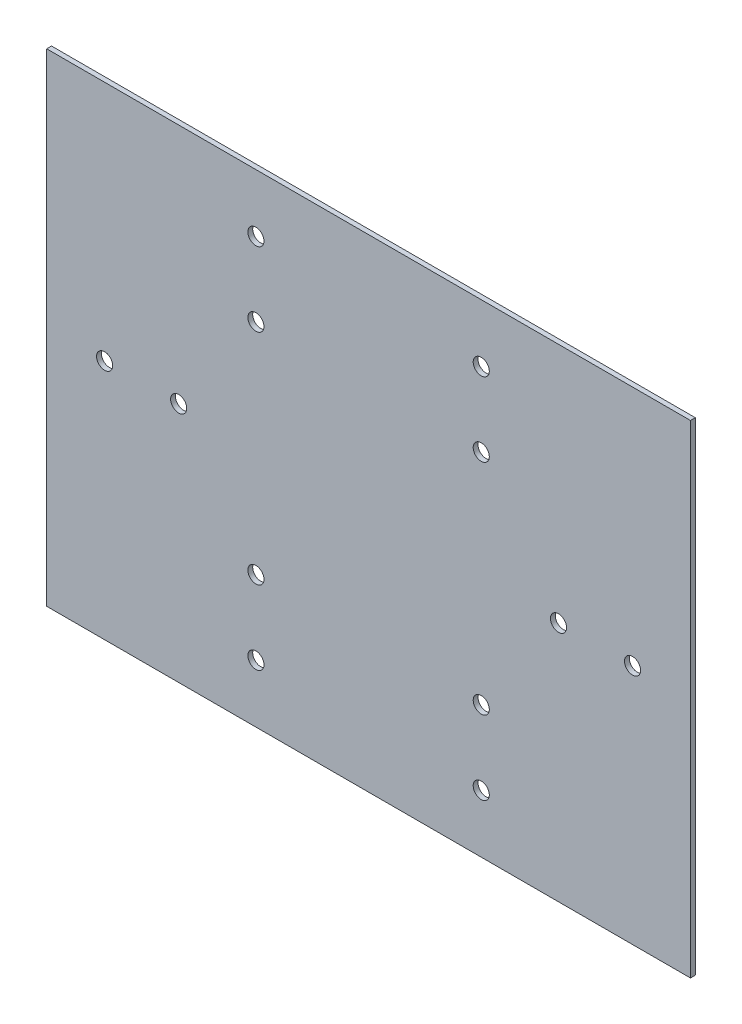
ISO-10303-21;
HEADER;
FILE_DESCRIPTION(('STEP AP214'),'2;1');
FILE_NAME('part.step','',(''),(''),'','','');
FILE_SCHEMA(('AUTOMOTIVE_DESIGN { 1 0 10303 214 1 1 1 1 }'));
ENDSEC;
DATA;
#1=APPLICATION_CONTEXT('core data for automotive mechanical design processes');
#2=APPLICATION_PROTOCOL_DEFINITION('international standard','automotive_design',2000,#1);
#3=PRODUCT_CONTEXT('',#1,'mechanical');
#4=PRODUCT('Part','Part','',(#3));
#5=PRODUCT_RELATED_PRODUCT_CATEGORY('part','',(#4));
#6=PRODUCT_DEFINITION_FORMATION('','',#4);
#7=PRODUCT_DEFINITION_CONTEXT('part definition',#1,'design');
#8=PRODUCT_DEFINITION('design','',#6,#7);
#9=PRODUCT_DEFINITION_SHAPE('','',#8);
#10=(LENGTH_UNIT() NAMED_UNIT(*) SI_UNIT(.MILLI.,.METRE.));
#11=(NAMED_UNIT(*) PLANE_ANGLE_UNIT() SI_UNIT($,.RADIAN.));
#12=(NAMED_UNIT(*) SI_UNIT($,.STERADIAN.) SOLID_ANGLE_UNIT());
#13=UNCERTAINTY_MEASURE_WITH_UNIT(LENGTH_MEASURE(1.E-05),#10,'distance_accuracy_value','');
#14=(GEOMETRIC_REPRESENTATION_CONTEXT(3) GLOBAL_UNCERTAINTY_ASSIGNED_CONTEXT((#13)) GLOBAL_UNIT_ASSIGNED_CONTEXT((#10,
#11,#12)) REPRESENTATION_CONTEXT('',''));
#15=CARTESIAN_POINT('',(0.,0.,0.));
#16=DIRECTION('',(0.,0.,1.));
#17=DIRECTION('',(1.,0.,0.));
#18=AXIS2_PLACEMENT_3D('',#15,#16,#17);
#19=CARTESIAN_POINT('',(0.,0.,1.5));
#20=DIRECTION('',(0.,0.,-1.));
#21=DIRECTION('',(-1.,0.,0.));
#22=AXIS2_PLACEMENT_3D('',#19,#20,#21);
#23=PLANE('',#22);
#24=DIRECTION('',(0.,1.,0.));
#25=VECTOR('',#24,1.);
#26=CARTESIAN_POINT('',(100.,-75.,1.5));
#27=LINE('',#26,#25);
#28=CARTESIAN_POINT('',(100.,-75.,1.5));
#29=VERTEX_POINT('',#28);
#30=CARTESIAN_POINT('',(100.,75.,1.5));
#31=VERTEX_POINT('',#30);
#32=EDGE_CURVE('E92',#29,#31,#27,.T.);
#33=ORIENTED_EDGE('',*,*,#32,.T.);
#34=DIRECTION('',(-1.,0.,0.));
#35=VECTOR('',#34,1.);
#36=CARTESIAN_POINT('',(-100.,75.,1.5));
#37=LINE('',#36,#35);
#38=CARTESIAN_POINT('',(-100.,75.,1.5));
#39=VERTEX_POINT('',#38);
#40=EDGE_CURVE('E87',#31,#39,#37,.T.);
#41=ORIENTED_EDGE('',*,*,#40,.T.);
#42=DIRECTION('',(0.,-1.,0.));
#43=VECTOR('',#42,1.);
#44=CARTESIAN_POINT('',(-100.,-75.,1.5));
#45=LINE('',#44,#43);
#46=CARTESIAN_POINT('',(-100.,-75.,1.5));
#47=VERTEX_POINT('',#46);
#48=EDGE_CURVE('E90',#39,#47,#45,.T.);
#49=ORIENTED_EDGE('',*,*,#48,.T.);
#50=DIRECTION('',(1.,0.,0.));
#51=VECTOR('',#50,1.);
#52=CARTESIAN_POINT('',(-100.,-75.,1.5));
#53=LINE('',#52,#51);
#54=EDGE_CURVE('E57',#47,#29,#53,.T.);
#55=ORIENTED_EDGE('',*,*,#54,.T.);
#56=EDGE_LOOP('',(#33,#41,#49,#55));
#57=FACE_BOUND('',#56,.T.);
#58=CARTESIAN_POINT('',(-82.,0.,1.5));
#59=DIRECTION('',(0.,0.,1.));
#60=DIRECTION('',(1.,0.,0.));
#61=AXIS2_PLACEMENT_3D('',#58,#59,#60);
#62=CIRCLE('',#61,2.50000000000001);
#63=CARTESIAN_POINT('',(-79.5,0.,1.5));
#64=VERTEX_POINT('',#63);
#65=EDGE_CURVE('E112',#64,#64,#62,.T.);
#66=ORIENTED_EDGE('',*,*,#65,.F.);
#67=EDGE_LOOP('',(#66));
#68=FACE_BOUND('',#67,.T.);
#69=CARTESIAN_POINT('',(-59.,0.,1.5));
#70=DIRECTION('',(0.,0.,1.));
#71=DIRECTION('',(1.,0.,0.));
#72=AXIS2_PLACEMENT_3D('',#69,#70,#71);
#73=CIRCLE('',#72,2.5);
#74=CARTESIAN_POINT('',(-56.5,0.,1.5));
#75=VERTEX_POINT('',#74);
#76=EDGE_CURVE('E134',#75,#75,#73,.T.);
#77=ORIENTED_EDGE('',*,*,#76,.F.);
#78=EDGE_LOOP('',(#77));
#79=FACE_BOUND('',#78,.T.);
#80=CARTESIAN_POINT('',(59.0000000000001,0.,1.5));
#81=DIRECTION('',(0.,0.,1.));
#82=DIRECTION('',(-1.,0.,0.));
#83=AXIS2_PLACEMENT_3D('',#80,#81,#82);
#84=CIRCLE('',#83,2.5);
#85=CARTESIAN_POINT('',(56.5000000000001,0.,1.5));
#86=VERTEX_POINT('',#85);
#87=EDGE_CURVE('E142',#86,#86,#84,.T.);
#88=ORIENTED_EDGE('',*,*,#87,.F.);
#89=EDGE_LOOP('',(#88));
#90=FACE_BOUND('',#89,.T.);
#91=CARTESIAN_POINT('',(82.0000000000001,0.,1.5));
#92=DIRECTION('',(0.,0.,1.));
#93=DIRECTION('',(-1.,0.,0.));
#94=AXIS2_PLACEMENT_3D('',#91,#92,#93);
#95=CIRCLE('',#94,2.50000000000001);
#96=CARTESIAN_POINT('',(79.5000000000001,0.,1.5));
#97=VERTEX_POINT('',#96);
#98=EDGE_CURVE('E150',#97,#97,#95,.T.);
#99=ORIENTED_EDGE('',*,*,#98,.F.);
#100=EDGE_LOOP('',(#99));
#101=FACE_BOUND('',#100,.T.);
#102=CARTESIAN_POINT('',(-35.,-34.,1.5));
#103=DIRECTION('',(0.,0.,1.));
#104=DIRECTION('',(1.,0.,0.));
#105=AXIS2_PLACEMENT_3D('',#102,#103,#104);
#106=CIRCLE('',#105,2.5);
#107=CARTESIAN_POINT('',(-32.5,-34.,1.5));
#108=VERTEX_POINT('',#107);
#109=EDGE_CURVE('E158',#108,#108,#106,.T.);
#110=ORIENTED_EDGE('',*,*,#109,.F.);
#111=EDGE_LOOP('',(#110));
#112=FACE_BOUND('',#111,.T.);
#113=CARTESIAN_POINT('',(-35.,-57.,1.5));
#114=DIRECTION('',(0.,0.,1.));
#115=DIRECTION('',(1.,0.,0.));
#116=AXIS2_PLACEMENT_3D('',#113,#114,#115);
#117=CIRCLE('',#116,2.5);
#118=CARTESIAN_POINT('',(-32.5,-57.,1.5));
#119=VERTEX_POINT('',#118);
#120=EDGE_CURVE('E166',#119,#119,#117,.T.);
#121=ORIENTED_EDGE('',*,*,#120,.F.);
#122=EDGE_LOOP('',(#121));
#123=FACE_BOUND('',#122,.T.);
#124=CARTESIAN_POINT('',(35.0000000000001,-57.,1.5));
#125=DIRECTION('',(0.,0.,1.));
#126=DIRECTION('',(-1.,0.,0.));
#127=AXIS2_PLACEMENT_3D('',#124,#125,#126);
#128=CIRCLE('',#127,2.5);
#129=CARTESIAN_POINT('',(32.5000000000001,-57.,1.5));
#130=VERTEX_POINT('',#129);
#131=EDGE_CURVE('E174',#130,#130,#128,.T.);
#132=ORIENTED_EDGE('',*,*,#131,.F.);
#133=EDGE_LOOP('',(#132));
#134=FACE_BOUND('',#133,.T.);
#135=CARTESIAN_POINT('',(35.0000000000001,-34.,1.5));
#136=DIRECTION('',(0.,0.,1.));
#137=DIRECTION('',(-1.,0.,0.));
#138=AXIS2_PLACEMENT_3D('',#135,#136,#137);
#139=CIRCLE('',#138,2.5);
#140=CARTESIAN_POINT('',(32.5000000000001,-34.,1.5));
#141=VERTEX_POINT('',#140);
#142=EDGE_CURVE('E182',#141,#141,#139,.T.);
#143=ORIENTED_EDGE('',*,*,#142,.F.);
#144=EDGE_LOOP('',(#143));
#145=FACE_BOUND('',#144,.T.);
#146=CARTESIAN_POINT('',(35.0000000000001,57.,1.5));
#147=DIRECTION('',(0.,0.,1.));
#148=DIRECTION('',(1.,0.,0.));
#149=AXIS2_PLACEMENT_3D('',#146,#147,#148);
#150=CIRCLE('',#149,2.5);
#151=CARTESIAN_POINT('',(37.5000000000001,57.,1.5));
#152=VERTEX_POINT('',#151);
#153=EDGE_CURVE('E190',#152,#152,#150,.T.);
#154=ORIENTED_EDGE('',*,*,#153,.F.);
#155=EDGE_LOOP('',(#154));
#156=FACE_BOUND('',#155,.T.);
#157=CARTESIAN_POINT('',(35.0000000000001,34.,1.5));
#158=DIRECTION('',(0.,0.,1.));
#159=DIRECTION('',(1.,0.,0.));
#160=AXIS2_PLACEMENT_3D('',#157,#158,#159);
#161=CIRCLE('',#160,2.5);
#162=CARTESIAN_POINT('',(37.5000000000001,34.,1.5));
#163=VERTEX_POINT('',#162);
#164=EDGE_CURVE('E198',#163,#163,#161,.T.);
#165=ORIENTED_EDGE('',*,*,#164,.F.);
#166=EDGE_LOOP('',(#165));
#167=FACE_BOUND('',#166,.T.);
#168=CARTESIAN_POINT('',(-35.,57.,1.5));
#169=DIRECTION('',(0.,0.,1.));
#170=DIRECTION('',(-1.,0.,0.));
#171=AXIS2_PLACEMENT_3D('',#168,#169,#170);
#172=CIRCLE('',#171,2.5);
#173=CARTESIAN_POINT('',(-37.5,57.,1.5));
#174=VERTEX_POINT('',#173);
#175=EDGE_CURVE('E206',#174,#174,#172,.T.);
#176=ORIENTED_EDGE('',*,*,#175,.F.);
#177=EDGE_LOOP('',(#176));
#178=FACE_BOUND('',#177,.T.);
#179=CARTESIAN_POINT('',(-35.,34.,1.5));
#180=DIRECTION('',(0.,0.,1.));
#181=DIRECTION('',(-1.,0.,0.));
#182=AXIS2_PLACEMENT_3D('',#179,#180,#181);
#183=CIRCLE('',#182,2.5);
#184=CARTESIAN_POINT('',(-37.5,34.,1.5));
#185=VERTEX_POINT('',#184);
#186=EDGE_CURVE('E214',#185,#185,#183,.T.);
#187=ORIENTED_EDGE('',*,*,#186,.F.);
#188=EDGE_LOOP('',(#187));
#189=FACE_BOUND('',#188,.T.);
#190=ADVANCED_FACE('F39',(#57,#68,#79,#90,#101,#112,#123,#134,#145,#156,#167,#178,#189),#23,.F.);
#191=CARTESIAN_POINT('',(0.,0.,0.));
#192=DIRECTION('',(0.,0.,-1.));
#193=DIRECTION('',(-1.,0.,0.));
#194=AXIS2_PLACEMENT_3D('',#191,#192,#193);
#195=PLANE('',#194);
#196=CARTESIAN_POINT('',(-35.,57.,0.));
#197=DIRECTION('',(0.,0.,1.));
#198=DIRECTION('',(-1.,0.,0.));
#199=AXIS2_PLACEMENT_3D('',#196,#197,#198);
#200=CIRCLE('',#199,2.5);
#201=CARTESIAN_POINT('',(-37.5,57.,0.));
#202=VERTEX_POINT('',#201);
#203=EDGE_CURVE('E210',#202,#202,#200,.T.);
#204=ORIENTED_EDGE('',*,*,#203,.T.);
#205=EDGE_LOOP('',(#204));
#206=FACE_BOUND('',#205,.T.);
#207=CARTESIAN_POINT('',(35.0000000000001,57.,0.));
#208=DIRECTION('',(0.,0.,1.));
#209=DIRECTION('',(1.,0.,0.));
#210=AXIS2_PLACEMENT_3D('',#207,#208,#209);
#211=CIRCLE('',#210,2.5);
#212=CARTESIAN_POINT('',(37.5000000000001,57.,0.));
#213=VERTEX_POINT('',#212);
#214=EDGE_CURVE('E194',#213,#213,#211,.T.);
#215=ORIENTED_EDGE('',*,*,#214,.T.);
#216=EDGE_LOOP('',(#215));
#217=FACE_BOUND('',#216,.T.);
#218=CARTESIAN_POINT('',(35.0000000000001,-57.,0.));
#219=DIRECTION('',(0.,0.,1.));
#220=DIRECTION('',(-1.,0.,0.));
#221=AXIS2_PLACEMENT_3D('',#218,#219,#220);
#222=CIRCLE('',#221,2.5);
#223=CARTESIAN_POINT('',(32.5000000000001,-57.,0.));
#224=VERTEX_POINT('',#223);
#225=EDGE_CURVE('E178',#224,#224,#222,.T.);
#226=ORIENTED_EDGE('',*,*,#225,.T.);
#227=EDGE_LOOP('',(#226));
#228=FACE_BOUND('',#227,.T.);
#229=CARTESIAN_POINT('',(-35.,-34.,0.));
#230=DIRECTION('',(0.,0.,1.));
#231=DIRECTION('',(1.,0.,0.));
#232=AXIS2_PLACEMENT_3D('',#229,#230,#231);
#233=CIRCLE('',#232,2.5);
#234=CARTESIAN_POINT('',(-32.5,-34.,0.));
#235=VERTEX_POINT('',#234);
#236=EDGE_CURVE('E162',#235,#235,#233,.T.);
#237=ORIENTED_EDGE('',*,*,#236,.T.);
#238=EDGE_LOOP('',(#237));
#239=FACE_BOUND('',#238,.T.);
#240=CARTESIAN_POINT('',(59.0000000000001,0.,0.));
#241=DIRECTION('',(0.,0.,1.));
#242=DIRECTION('',(-1.,0.,0.));
#243=AXIS2_PLACEMENT_3D('',#240,#241,#242);
#244=CIRCLE('',#243,2.5);
#245=CARTESIAN_POINT('',(56.5000000000001,0.,0.));
#246=VERTEX_POINT('',#245);
#247=EDGE_CURVE('E146',#246,#246,#244,.T.);
#248=ORIENTED_EDGE('',*,*,#247,.T.);
#249=EDGE_LOOP('',(#248));
#250=FACE_BOUND('',#249,.T.);
#251=CARTESIAN_POINT('',(-82.,0.,0.));
#252=DIRECTION('',(0.,0.,1.));
#253=DIRECTION('',(1.,0.,0.));
#254=AXIS2_PLACEMENT_3D('',#251,#252,#253);
#255=CIRCLE('',#254,2.50000000000001);
#256=CARTESIAN_POINT('',(-79.5,0.,0.));
#257=VERTEX_POINT('',#256);
#258=EDGE_CURVE('E130',#257,#257,#255,.T.);
#259=ORIENTED_EDGE('',*,*,#258,.T.);
#260=EDGE_LOOP('',(#259));
#261=FACE_BOUND('',#260,.T.);
#262=DIRECTION('',(0.,1.,0.));
#263=VECTOR('',#262,1.);
#264=CARTESIAN_POINT('',(100.,-75.,0.));
#265=LINE('',#264,#263);
#266=CARTESIAN_POINT('',(100.,-75.,0.));
#267=VERTEX_POINT('',#266);
#268=CARTESIAN_POINT('',(100.,75.,0.));
#269=VERTEX_POINT('',#268);
#270=EDGE_CURVE('E108',#267,#269,#265,.T.);
#271=ORIENTED_EDGE('',*,*,#270,.F.);
#272=DIRECTION('',(1.,0.,0.));
#273=VECTOR('',#272,1.);
#274=CARTESIAN_POINT('',(-100.,-75.,0.));
#275=LINE('',#274,#273);
#276=CARTESIAN_POINT('',(-100.,-75.,0.));
#277=VERTEX_POINT('',#276);
#278=EDGE_CURVE('E80',#277,#267,#275,.T.);
#279=ORIENTED_EDGE('',*,*,#278,.F.);
#280=DIRECTION('',(0.,-1.,0.));
#281=VECTOR('',#280,1.);
#282=CARTESIAN_POINT('',(-100.,-75.,0.));
#283=LINE('',#282,#281);
#284=CARTESIAN_POINT('',(-100.,75.,0.));
#285=VERTEX_POINT('',#284);
#286=EDGE_CURVE('E74',#285,#277,#283,.T.);
#287=ORIENTED_EDGE('',*,*,#286,.F.);
#288=DIRECTION('',(-1.,0.,0.));
#289=VECTOR('',#288,1.);
#290=CARTESIAN_POINT('',(-100.,75.,0.));
#291=LINE('',#290,#289);
#292=EDGE_CURVE('E97',#269,#285,#291,.T.);
#293=ORIENTED_EDGE('',*,*,#292,.F.);
#294=EDGE_LOOP('',(#271,#279,#287,#293));
#295=FACE_BOUND('',#294,.T.);
#296=CARTESIAN_POINT('',(-59.,0.,0.));
#297=DIRECTION('',(0.,0.,1.));
#298=DIRECTION('',(1.,0.,0.));
#299=AXIS2_PLACEMENT_3D('',#296,#297,#298);
#300=CIRCLE('',#299,2.5);
#301=CARTESIAN_POINT('',(-56.5,0.,0.));
#302=VERTEX_POINT('',#301);
#303=EDGE_CURVE('E138',#302,#302,#300,.T.);
#304=ORIENTED_EDGE('',*,*,#303,.T.);
#305=EDGE_LOOP('',(#304));
#306=FACE_BOUND('',#305,.T.);
#307=CARTESIAN_POINT('',(82.0000000000001,0.,0.));
#308=DIRECTION('',(0.,0.,1.));
#309=DIRECTION('',(-1.,0.,0.));
#310=AXIS2_PLACEMENT_3D('',#307,#308,#309);
#311=CIRCLE('',#310,2.50000000000001);
#312=CARTESIAN_POINT('',(79.5000000000001,0.,0.));
#313=VERTEX_POINT('',#312);
#314=EDGE_CURVE('E154',#313,#313,#311,.T.);
#315=ORIENTED_EDGE('',*,*,#314,.T.);
#316=EDGE_LOOP('',(#315));
#317=FACE_BOUND('',#316,.T.);
#318=CARTESIAN_POINT('',(-35.,-57.,0.));
#319=DIRECTION('',(0.,0.,1.));
#320=DIRECTION('',(1.,0.,0.));
#321=AXIS2_PLACEMENT_3D('',#318,#319,#320);
#322=CIRCLE('',#321,2.5);
#323=CARTESIAN_POINT('',(-32.5,-57.,0.));
#324=VERTEX_POINT('',#323);
#325=EDGE_CURVE('E170',#324,#324,#322,.T.);
#326=ORIENTED_EDGE('',*,*,#325,.T.);
#327=EDGE_LOOP('',(#326));
#328=FACE_BOUND('',#327,.T.);
#329=CARTESIAN_POINT('',(35.0000000000001,-34.,0.));
#330=DIRECTION('',(0.,0.,1.));
#331=DIRECTION('',(-1.,0.,0.));
#332=AXIS2_PLACEMENT_3D('',#329,#330,#331);
#333=CIRCLE('',#332,2.5);
#334=CARTESIAN_POINT('',(32.5000000000001,-34.,0.));
#335=VERTEX_POINT('',#334);
#336=EDGE_CURVE('E186',#335,#335,#333,.T.);
#337=ORIENTED_EDGE('',*,*,#336,.T.);
#338=EDGE_LOOP('',(#337));
#339=FACE_BOUND('',#338,.T.);
#340=CARTESIAN_POINT('',(35.0000000000001,34.,0.));
#341=DIRECTION('',(0.,0.,1.));
#342=DIRECTION('',(1.,0.,0.));
#343=AXIS2_PLACEMENT_3D('',#340,#341,#342);
#344=CIRCLE('',#343,2.5);
#345=CARTESIAN_POINT('',(37.5000000000001,34.,0.));
#346=VERTEX_POINT('',#345);
#347=EDGE_CURVE('E202',#346,#346,#344,.T.);
#348=ORIENTED_EDGE('',*,*,#347,.T.);
#349=EDGE_LOOP('',(#348));
#350=FACE_BOUND('',#349,.T.);
#351=CARTESIAN_POINT('',(-35.,34.,0.));
#352=DIRECTION('',(0.,0.,1.));
#353=DIRECTION('',(-1.,0.,0.));
#354=AXIS2_PLACEMENT_3D('',#351,#352,#353);
#355=CIRCLE('',#354,2.5);
#356=CARTESIAN_POINT('',(-37.5,34.,0.));
#357=VERTEX_POINT('',#356);
#358=EDGE_CURVE('E218',#357,#357,#355,.T.);
#359=ORIENTED_EDGE('',*,*,#358,.T.);
#360=EDGE_LOOP('',(#359));
#361=FACE_BOUND('',#360,.T.);
#362=ADVANCED_FACE('F125',(#206,#217,#228,#239,#250,#261,#295,#306,#317,#328,#339,#350,#361),
#195,.T.);
#363=CARTESIAN_POINT('',(100.,-75.,1.5));
#364=DIRECTION('',(-1.,0.,0.));
#365=DIRECTION('',(0.,0.,1.));
#366=AXIS2_PLACEMENT_3D('',#363,#364,#365);
#367=PLANE('',#366);
#368=ORIENTED_EDGE('',*,*,#270,.T.);
#369=DIRECTION('',(0.,0.,-1.));
#370=VECTOR('',#369,1.);
#371=CARTESIAN_POINT('',(100.,75.,1.5));
#372=LINE('',#371,#370);
#373=EDGE_CURVE('E11',#31,#269,#372,.T.);
#374=ORIENTED_EDGE('',*,*,#373,.F.);
#375=ORIENTED_EDGE('',*,*,#32,.F.);
#376=DIRECTION('',(0.,0.,-1.));
#377=VECTOR('',#376,1.);
#378=CARTESIAN_POINT('',(100.,-75.,1.5));
#379=LINE('',#378,#377);
#380=EDGE_CURVE('E104',#29,#267,#379,.T.);
#381=ORIENTED_EDGE('',*,*,#380,.T.);
#382=EDGE_LOOP('',(#368,#374,#375,#381));
#383=FACE_BOUND('',#382,.T.);
#384=ADVANCED_FACE('F41',(#383),#367,.F.);
#385=CARTESIAN_POINT('',(-100.,75.,1.5));
#386=DIRECTION('',(0.,-1.,0.));
#387=DIRECTION('',(0.,0.,-1.));
#388=AXIS2_PLACEMENT_3D('',#385,#386,#387);
#389=PLANE('',#388);
#390=ORIENTED_EDGE('',*,*,#292,.T.);
#391=DIRECTION('',(0.,0.,-1.));
#392=VECTOR('',#391,1.);
#393=CARTESIAN_POINT('',(-100.,75.,1.5));
#394=LINE('',#393,#392);
#395=EDGE_CURVE('E49',#39,#285,#394,.T.);
#396=ORIENTED_EDGE('',*,*,#395,.F.);
#397=ORIENTED_EDGE('',*,*,#40,.F.);
#398=ORIENTED_EDGE('',*,*,#373,.T.);
#399=EDGE_LOOP('',(#390,#396,#397,#398));
#400=FACE_BOUND('',#399,.T.);
#401=ADVANCED_FACE('F96',(#400),#389,.F.);
#402=CARTESIAN_POINT('',(-100.,-75.,1.5));
#403=DIRECTION('',(1.,0.,0.));
#404=DIRECTION('',(0.,0.,-1.));
#405=AXIS2_PLACEMENT_3D('',#402,#403,#404);
#406=PLANE('',#405);
#407=ORIENTED_EDGE('',*,*,#286,.T.);
#408=DIRECTION('',(0.,0.,-1.));
#409=VECTOR('',#408,1.);
#410=CARTESIAN_POINT('',(-100.,-75.,1.5));
#411=LINE('',#410,#409);
#412=EDGE_CURVE('E99',#47,#277,#411,.T.);
#413=ORIENTED_EDGE('',*,*,#412,.F.);
#414=ORIENTED_EDGE('',*,*,#48,.F.);
#415=ORIENTED_EDGE('',*,*,#395,.T.);
#416=EDGE_LOOP('',(#407,#413,#414,#415));
#417=FACE_BOUND('',#416,.T.);
#418=ADVANCED_FACE('F100',(#417),#406,.F.);
#419=CARTESIAN_POINT('',(-100.,-75.,1.5));
#420=DIRECTION('',(0.,1.,0.));
#421=DIRECTION('',(-1.,0.,0.));
#422=AXIS2_PLACEMENT_3D('',#419,#420,#421);
#423=PLANE('',#422);
#424=ORIENTED_EDGE('',*,*,#278,.T.);
#425=ORIENTED_EDGE('',*,*,#380,.F.);
#426=ORIENTED_EDGE('',*,*,#54,.F.);
#427=ORIENTED_EDGE('',*,*,#412,.T.);
#428=EDGE_LOOP('',(#424,#425,#426,#427));
#429=FACE_BOUND('',#428,.T.);
#430=ADVANCED_FACE('F122',(#429),#423,.F.);
#431=CARTESIAN_POINT('',(-82.,0.,1.5));
#432=DIRECTION('',(0.,0.,-1.));
#433=DIRECTION('',(-1.,0.,0.));
#434=AXIS2_PLACEMENT_3D('',#431,#432,#433);
#435=CYLINDRICAL_SURFACE('',#434,2.50000000000001);
#436=ORIENTED_EDGE('',*,*,#65,.T.);
#437=EDGE_LOOP('',(#436));
#438=FACE_BOUND('',#437,.T.);
#439=ORIENTED_EDGE('',*,*,#258,.F.);
#440=EDGE_LOOP('',(#439));
#441=FACE_BOUND('',#440,.T.);
#442=ADVANCED_FACE('F237',(#438,#441),#435,.F.);
#443=CARTESIAN_POINT('',(-59.,0.,1.5));
#444=DIRECTION('',(0.,0.,-1.));
#445=DIRECTION('',(-1.,0.,0.));
#446=AXIS2_PLACEMENT_3D('',#443,#444,#445);
#447=CYLINDRICAL_SURFACE('',#446,2.5);
#448=ORIENTED_EDGE('',*,*,#76,.T.);
#449=EDGE_LOOP('',(#448));
#450=FACE_BOUND('',#449,.T.);
#451=ORIENTED_EDGE('',*,*,#303,.F.);
#452=EDGE_LOOP('',(#451));
#453=FACE_BOUND('',#452,.T.);
#454=ADVANCED_FACE('F283',(#450,#453),#447,.F.);
#455=CARTESIAN_POINT('',(59.0000000000001,0.,1.5));
#456=DIRECTION('',(0.,0.,-1.));
#457=DIRECTION('',(-1.,0.,0.));
#458=AXIS2_PLACEMENT_3D('',#455,#456,#457);
#459=CYLINDRICAL_SURFACE('',#458,2.5);
#460=ORIENTED_EDGE('',*,*,#87,.T.);
#461=EDGE_LOOP('',(#460));
#462=FACE_BOUND('',#461,.T.);
#463=ORIENTED_EDGE('',*,*,#247,.F.);
#464=EDGE_LOOP('',(#463));
#465=FACE_BOUND('',#464,.T.);
#466=ADVANCED_FACE('F291',(#462,#465),#459,.F.);
#467=CARTESIAN_POINT('',(82.0000000000001,0.,1.5));
#468=DIRECTION('',(0.,0.,-1.));
#469=DIRECTION('',(-1.,0.,0.));
#470=AXIS2_PLACEMENT_3D('',#467,#468,#469);
#471=CYLINDRICAL_SURFACE('',#470,2.50000000000001);
#472=ORIENTED_EDGE('',*,*,#98,.T.);
#473=EDGE_LOOP('',(#472));
#474=FACE_BOUND('',#473,.T.);
#475=ORIENTED_EDGE('',*,*,#314,.F.);
#476=EDGE_LOOP('',(#475));
#477=FACE_BOUND('',#476,.T.);
#478=ADVANCED_FACE('F299',(#474,#477),#471,.F.);
#479=CARTESIAN_POINT('',(-35.,-34.,1.5));
#480=DIRECTION('',(0.,0.,-1.));
#481=DIRECTION('',(-1.,0.,0.));
#482=AXIS2_PLACEMENT_3D('',#479,#480,#481);
#483=CYLINDRICAL_SURFACE('',#482,2.5);
#484=ORIENTED_EDGE('',*,*,#109,.T.);
#485=EDGE_LOOP('',(#484));
#486=FACE_BOUND('',#485,.T.);
#487=ORIENTED_EDGE('',*,*,#236,.F.);
#488=EDGE_LOOP('',(#487));
#489=FACE_BOUND('',#488,.T.);
#490=ADVANCED_FACE('F308',(#486,#489),#483,.F.);
#491=CARTESIAN_POINT('',(-35.,-57.,1.5));
#492=DIRECTION('',(0.,0.,-1.));
#493=DIRECTION('',(-1.,0.,0.));
#494=AXIS2_PLACEMENT_3D('',#491,#492,#493);
#495=CYLINDRICAL_SURFACE('',#494,2.5);
#496=ORIENTED_EDGE('',*,*,#120,.T.);
#497=EDGE_LOOP('',(#496));
#498=FACE_BOUND('',#497,.T.);
#499=ORIENTED_EDGE('',*,*,#325,.F.);
#500=EDGE_LOOP('',(#499));
#501=FACE_BOUND('',#500,.T.);
#502=ADVANCED_FACE('F317',(#498,#501),#495,.F.);
#503=CARTESIAN_POINT('',(35.0000000000001,-57.,1.5));
#504=DIRECTION('',(0.,0.,-1.));
#505=DIRECTION('',(-1.,0.,0.));
#506=AXIS2_PLACEMENT_3D('',#503,#504,#505);
#507=CYLINDRICAL_SURFACE('',#506,2.5);
#508=ORIENTED_EDGE('',*,*,#131,.T.);
#509=EDGE_LOOP('',(#508));
#510=FACE_BOUND('',#509,.T.);
#511=ORIENTED_EDGE('',*,*,#225,.F.);
#512=EDGE_LOOP('',(#511));
#513=FACE_BOUND('',#512,.T.);
#514=ADVANCED_FACE('F326',(#510,#513),#507,.F.);
#515=CARTESIAN_POINT('',(35.0000000000001,-34.,1.5));
#516=DIRECTION('',(0.,0.,-1.));
#517=DIRECTION('',(-1.,0.,0.));
#518=AXIS2_PLACEMENT_3D('',#515,#516,#517);
#519=CYLINDRICAL_SURFACE('',#518,2.5);
#520=ORIENTED_EDGE('',*,*,#142,.T.);
#521=EDGE_LOOP('',(#520));
#522=FACE_BOUND('',#521,.T.);
#523=ORIENTED_EDGE('',*,*,#336,.F.);
#524=EDGE_LOOP('',(#523));
#525=FACE_BOUND('',#524,.T.);
#526=ADVANCED_FACE('F335',(#522,#525),#519,.F.);
#527=CARTESIAN_POINT('',(35.0000000000001,57.,1.5));
#528=DIRECTION('',(0.,0.,-1.));
#529=DIRECTION('',(-1.,0.,0.));
#530=AXIS2_PLACEMENT_3D('',#527,#528,#529);
#531=CYLINDRICAL_SURFACE('',#530,2.5);
#532=ORIENTED_EDGE('',*,*,#153,.T.);
#533=EDGE_LOOP('',(#532));
#534=FACE_BOUND('',#533,.T.);
#535=ORIENTED_EDGE('',*,*,#214,.F.);
#536=EDGE_LOOP('',(#535));
#537=FACE_BOUND('',#536,.T.);
#538=ADVANCED_FACE('F344',(#534,#537),#531,.F.);
#539=CARTESIAN_POINT('',(35.0000000000001,34.,1.5));
#540=DIRECTION('',(0.,0.,-1.));
#541=DIRECTION('',(-1.,0.,0.));
#542=AXIS2_PLACEMENT_3D('',#539,#540,#541);
#543=CYLINDRICAL_SURFACE('',#542,2.5);
#544=ORIENTED_EDGE('',*,*,#164,.T.);
#545=EDGE_LOOP('',(#544));
#546=FACE_BOUND('',#545,.T.);
#547=ORIENTED_EDGE('',*,*,#347,.F.);
#548=EDGE_LOOP('',(#547));
#549=FACE_BOUND('',#548,.T.);
#550=ADVANCED_FACE('F353',(#546,#549),#543,.F.);
#551=CARTESIAN_POINT('',(-35.,57.,1.5));
#552=DIRECTION('',(0.,0.,-1.));
#553=DIRECTION('',(-1.,0.,0.));
#554=AXIS2_PLACEMENT_3D('',#551,#552,#553);
#555=CYLINDRICAL_SURFACE('',#554,2.5);
#556=ORIENTED_EDGE('',*,*,#175,.T.);
#557=EDGE_LOOP('',(#556));
#558=FACE_BOUND('',#557,.T.);
#559=ORIENTED_EDGE('',*,*,#203,.F.);
#560=EDGE_LOOP('',(#559));
#561=FACE_BOUND('',#560,.T.);
#562=ADVANCED_FACE('F362',(#558,#561),#555,.F.);
#563=CARTESIAN_POINT('',(-35.,34.,1.5));
#564=DIRECTION('',(0.,0.,-1.));
#565=DIRECTION('',(-1.,0.,0.));
#566=AXIS2_PLACEMENT_3D('',#563,#564,#565);
#567=CYLINDRICAL_SURFACE('',#566,2.5);
#568=ORIENTED_EDGE('',*,*,#186,.T.);
#569=EDGE_LOOP('',(#568));
#570=FACE_BOUND('',#569,.T.);
#571=ORIENTED_EDGE('',*,*,#358,.F.);
#572=EDGE_LOOP('',(#571));
#573=FACE_BOUND('',#572,.T.);
#574=ADVANCED_FACE('F226',(#570,#573),#567,.F.);
#575=CLOSED_SHELL('',(#190,#362,#384,#401,#418,#430,#442,#454,#466,#478,#490,#502,#514,#526,
#538,#550,#562,#574));
#576=MANIFOLD_SOLID_BREP('B2',#575);
#577=ADVANCED_BREP_SHAPE_REPRESENTATION('',(#18,#576),#14);
#578=SHAPE_DEFINITION_REPRESENTATION(#9,#577);
ENDSEC;
END-ISO-10303-21;
